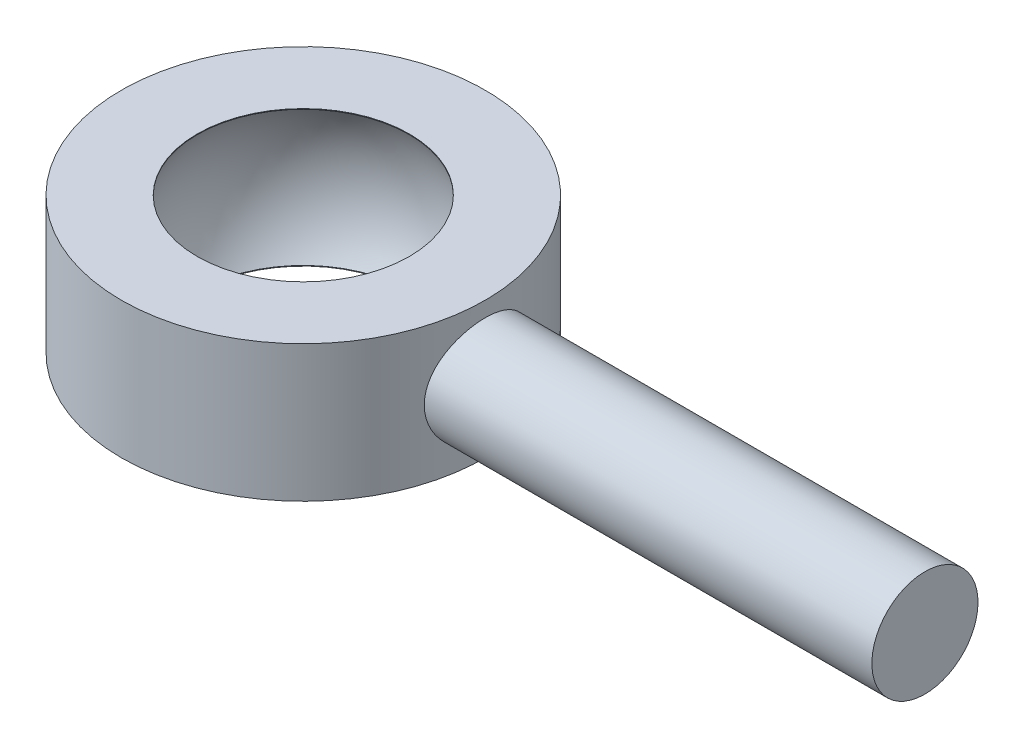
ISO-10303-21;
HEADER;
FILE_DESCRIPTION(('STEP AP214'),'2;1');
FILE_NAME('part.step','',(''),(''),'','','');
FILE_SCHEMA(('AUTOMOTIVE_DESIGN { 1 0 10303 214 1 1 1 1 }'));
ENDSEC;
DATA;
#1=APPLICATION_CONTEXT('core data for automotive mechanical design processes');
#2=APPLICATION_PROTOCOL_DEFINITION('international standard','automotive_design',2000,#1);
#3=PRODUCT_CONTEXT('',#1,'mechanical');
#4=PRODUCT('Part','Part','',(#3));
#5=PRODUCT_RELATED_PRODUCT_CATEGORY('part','',(#4));
#6=PRODUCT_DEFINITION_FORMATION('','',#4);
#7=PRODUCT_DEFINITION_CONTEXT('part definition',#1,'design');
#8=PRODUCT_DEFINITION('design','',#6,#7);
#9=PRODUCT_DEFINITION_SHAPE('','',#8);
#10=(LENGTH_UNIT() NAMED_UNIT(*) SI_UNIT(.MILLI.,.METRE.));
#11=(NAMED_UNIT(*) PLANE_ANGLE_UNIT() SI_UNIT($,.RADIAN.));
#12=(NAMED_UNIT(*) SI_UNIT($,.STERADIAN.) SOLID_ANGLE_UNIT());
#13=UNCERTAINTY_MEASURE_WITH_UNIT(LENGTH_MEASURE(1.E-05),#10,'distance_accuracy_value','');
#14=(GEOMETRIC_REPRESENTATION_CONTEXT(3) GLOBAL_UNCERTAINTY_ASSIGNED_CONTEXT((#13)) GLOBAL_UNIT_ASSIGNED_CONTEXT((#10,
#11,#12)) REPRESENTATION_CONTEXT('',''));
#15=CARTESIAN_POINT('',(0.,0.,0.));
#16=DIRECTION('',(0.,0.,1.));
#17=DIRECTION('',(1.,0.,0.));
#18=AXIS2_PLACEMENT_3D('',#15,#16,#17);
#19=CARTESIAN_POINT('',(-12.,4.5,0.));
#20=DIRECTION('',(0.,-1.,0.));
#21=DIRECTION('',(0.,0.,-1.));
#22=AXIS2_PLACEMENT_3D('',#19,#20,#21);
#23=CYLINDRICAL_SURFACE('',#22,7.);
#24=CARTESIAN_POINT('',(-12.,-4.45982062419555,0.));
#25=DIRECTION('',(0.,1.,0.));
#26=DIRECTION('',(0.,0.,1.));
#27=AXIS2_PLACEMENT_3D('',#24,#25,#26);
#28=CIRCLE('',#27,7.);
#29=CARTESIAN_POINT('',(-12.,-4.45982062419555,7.));
#30=VERTEX_POINT('',#29);
#31=EDGE_CURVE('E46',#30,#30,#28,.F.);
#32=ORIENTED_EDGE('',*,*,#31,.F.);
#33=EDGE_LOOP('',(#32));
#34=FACE_BOUND('',#33,.T.);
#35=CARTESIAN_POINT('',(-12.,-4.5,0.));
#36=DIRECTION('',(0.,1.,0.));
#37=DIRECTION('',(0.,0.,1.));
#38=AXIS2_PLACEMENT_3D('',#35,#36,#37);
#39=CIRCLE('',#38,7.);
#40=CARTESIAN_POINT('',(-12.,-4.5,7.));
#41=VERTEX_POINT('',#40);
#42=EDGE_CURVE('E108',#41,#41,#39,.T.);
#43=ORIENTED_EDGE('',*,*,#42,.F.);
#44=EDGE_LOOP('',(#43));
#45=FACE_BOUND('',#44,.T.);
#46=ADVANCED_FACE('F41',(#34,#45),#23,.F.);
#47=CARTESIAN_POINT('',(-12.,4.5,0.));
#48=DIRECTION('',(0.,1.,0.));
#49=DIRECTION('',(0.,0.,1.));
#50=AXIS2_PLACEMENT_3D('',#47,#48,#49);
#51=PLANE('',#50);
#52=CARTESIAN_POINT('',(-12.,4.5,0.));
#53=DIRECTION('',(0.,1.,0.));
#54=DIRECTION('',(0.,0.,1.));
#55=AXIS2_PLACEMENT_3D('',#52,#53,#54);
#56=CIRCLE('',#55,12.);
#57=CARTESIAN_POINT('',(-12.,4.5,12.));
#58=VERTEX_POINT('',#57);
#59=EDGE_CURVE('E55',#58,#58,#56,.T.);
#60=ORIENTED_EDGE('',*,*,#59,.T.);
#61=EDGE_LOOP('',(#60));
#62=FACE_BOUND('',#61,.T.);
#63=CARTESIAN_POINT('',(-12.,4.5,0.));
#64=DIRECTION('',(0.,1.,0.));
#65=DIRECTION('',(0.,0.,1.));
#66=AXIS2_PLACEMENT_3D('',#63,#64,#65);
#67=CIRCLE('',#66,7.);
#68=CARTESIAN_POINT('',(-12.,4.5,7.));
#69=VERTEX_POINT('',#68);
#70=EDGE_CURVE('E103',#69,#69,#67,.T.);
#71=ORIENTED_EDGE('',*,*,#70,.F.);
#72=EDGE_LOOP('',(#71));
#73=FACE_BOUND('',#72,.T.);
#74=ADVANCED_FACE('F69',(#62,#73),#51,.T.);
#75=CARTESIAN_POINT('',(-12.,4.5,0.));
#76=DIRECTION('',(0.,-1.,0.));
#77=DIRECTION('',(0.,0.,-1.));
#78=AXIS2_PLACEMENT_3D('',#75,#76,#77);
#79=CYLINDRICAL_SURFACE('',#78,12.);
#80=CARTESIAN_POINT('',(-0.521759716751001,0.,-3.5));
#81=CARTESIAN_POINT('',(-0.521757295311629,0.192054319913251,-3.49999696286623));
#82=CARTESIAN_POINT('',(-0.51688678631151,0.38413898889608,-3.48413840403905));
#83=CARTESIAN_POINT('',(-0.498003614826217,0.762710310940683,-3.42127517544508));
#84=CARTESIAN_POINT('',(-0.483987509541419,0.949194828197747,-3.37425877640989));
#85=CARTESIAN_POINT('',(-0.448532671250005,1.31103196548036,-3.25079782037676));
#86=CARTESIAN_POINT('',(-0.42710578599941,1.48640182836943,-3.17440021398415));
#87=CARTESIAN_POINT('',(-0.379259441413058,1.8218747579113,-2.99449806960499));
#88=CARTESIAN_POINT('',(-0.352839325000468,1.98197581111103,-2.89098996336001));
#89=CARTESIAN_POINT('',(-0.297097239994067,2.28715528113393,-2.65649108658758));
#90=CARTESIAN_POINT('',(-0.267716059999761,2.43170941722325,-2.52483193403778));
#91=CARTESIAN_POINT('',(-0.20986950760281,2.69703124061767,-2.23920199384476));
#92=CARTESIAN_POINT('',(-0.181404247017523,2.81779603281872,-2.08522849455367));
#93=CARTESIAN_POINT('',(-0.127927275855424,3.03436409529048,-1.75563543194071));
#94=CARTESIAN_POINT('',(-0.102993491279187,3.12963626955094,-1.57965314938518));
#95=CARTESIAN_POINT('',(-0.0600745361078176,3.28903382975871,-1.21331555166962));
#96=CARTESIAN_POINT('',(-0.0420879531270309,3.35316554733109,-1.02296316740898));
#97=CARTESIAN_POINT('',(-0.0155088824085107,3.44673668029716,-0.638770652831314));
#98=CARTESIAN_POINT('',(-0.00667473818463911,3.47707021864098,-0.445165306381285));
#99=CARTESIAN_POINT('',(0.00145352374923532,3.50500747804645,-0.0554253886246924));
#100=CARTESIAN_POINT('',(0.000749539076122961,3.50261770943008,0.14070867183541));
#101=CARTESIAN_POINT('',(-0.00994668649007664,3.46578404975842,0.523678678020408));
#102=CARTESIAN_POINT('',(-0.0196585234871959,3.43230780709568,0.71061674652038));
#103=CARTESIAN_POINT('',(-0.0469410355968007,3.33582758307802,1.07609625263408));
#104=CARTESIAN_POINT('',(-0.0645121973369639,3.27282177332232,1.25463716956276));
#105=CARTESIAN_POINT('',(-0.105934000809501,3.11839365061319,1.6005983824538));
#106=CARTESIAN_POINT('',(-0.129852976852992,3.02666002072006,1.76787119601618));
#107=CARTESIAN_POINT('',(-0.181422680907727,2.81762444777958,2.08496400151024));
#108=CARTESIAN_POINT('',(-0.209074254364043,2.70031670840276,2.23478002505818));
#109=CARTESIAN_POINT('',(-0.266331786572174,2.43841266854742,2.51848283881575));
#110=CARTESIAN_POINT('',(-0.295972240425294,2.29297628495534,2.65158814049179));
#111=CARTESIAN_POINT('',(-0.352976637943892,1.98155158066776,2.89173320382774));
#112=CARTESIAN_POINT('',(-0.38034038024257,1.81556144529201,2.99877066149234));
#113=CARTESIAN_POINT('',(-0.429851613256215,1.46577922805441,3.1844975706006));
#114=CARTESIAN_POINT('',(-0.451952072450695,1.2818459374275,3.26293452741342));
#115=CARTESIAN_POINT('',(-0.48787099501051,0.90258996382488,3.38749702322845));
#116=CARTESIAN_POINT('',(-0.50169198697179,0.707270778182911,3.43363242803382));
#117=CARTESIAN_POINT('',(-0.518936281294805,0.318192165633026,3.49085134441019));
#118=CARTESIAN_POINT('',(-0.522710101013617,0.12462197576152,3.50311706489073));
#119=CARTESIAN_POINT('',(-0.520399403487547,-0.261812448404875,3.49553843290767));
#120=CARTESIAN_POINT('',(-0.514316176930623,-0.45467677181226,3.47569828440757));
#121=CARTESIAN_POINT('',(-0.493319467601853,-0.829393663833188,3.40552137026396));
#122=CARTESIAN_POINT('',(-0.478622752392329,-1.01139967774621,3.35593256227463));
#123=CARTESIAN_POINT('',(-0.442276286336255,-1.3645003934711,3.22852632632489));
#124=CARTESIAN_POINT('',(-0.420625502838271,-1.53559347022977,3.15070470568188));
#125=CARTESIAN_POINT('',(-0.372120430164632,-1.86685570801902,2.96675904259821));
#126=CARTESIAN_POINT('',(-0.345147058820198,-2.02663279365816,2.8599610942228));
#127=CARTESIAN_POINT('',(-0.289297968185874,-2.32643040505443,2.62190362455645));
#128=CARTESIAN_POINT('',(-0.260421819819611,-2.46644645217717,2.49063857364422));
#129=CARTESIAN_POINT('',(-0.202783865184941,-2.72784930285609,2.20183802552396));
#130=CARTESIAN_POINT('',(-0.174062275035525,-2.84840140702085,2.04353719240707));
#131=CARTESIAN_POINT('',(-0.121003757978662,-3.06124277601848,1.70827645314679));
#132=CARTESIAN_POINT('',(-0.0966666057348402,-3.15353349350435,1.53131750667088));
#133=CARTESIAN_POINT('',(-0.0552718890727842,-3.30634556970008,1.16496975824715));
#134=CARTESIAN_POINT('',(-0.0381595779408091,-3.36710668199115,0.975687458510748));
#135=CARTESIAN_POINT('',(-0.0129007782539957,-3.45577467725069,0.589013781580671));
#136=CARTESIAN_POINT('',(-0.00475187751736208,-3.48369039952385,0.391624600904921));
#137=CARTESIAN_POINT('',(0.00152356547553752,-3.50523315149888,0.00207487923933639));
#138=CARTESIAN_POINT('',(4.91736449784747E-06,-3.50007401434837,-0.190013681462302));
#139=CARTESIAN_POINT('',(-0.0120566434230335,-3.45849353885937,-0.570471432028531));
#140=CARTESIAN_POINT('',(-0.0225990918399476,-3.42207380882634,-0.758840812728705));
#141=CARTESIAN_POINT('',(-0.0514301448433681,-3.31974179524093,-1.1247529597905));
#142=CARTESIAN_POINT('',(-0.0696429277148577,-3.25411784653956,-1.30238274255004));
#143=CARTESIAN_POINT('',(-0.111927020049091,-3.09549711351658,-1.64420678839108));
#144=CARTESIAN_POINT('',(-0.13599926057279,-3.00249597849994,-1.80839891069819));
#145=CARTESIAN_POINT('',(-0.188380133951649,-2.78844690367086,-2.12415926367373));
#146=CARTESIAN_POINT('',(-0.21679609656977,-2.66662590053017,-2.2751855176197));
#147=CARTESIAN_POINT('',(-0.274296338931485,-2.39980626216935,-2.55505931549894));
#148=CARTESIAN_POINT('',(-0.30338080451788,-2.25480111340017,-2.68390060541108));
#149=CARTESIAN_POINT('',(-0.359868639461855,-1.94090408824677,-2.91932045343864));
#150=CARTESIAN_POINT('',(-0.387203104011385,-1.77146170351348,-3.02518327680785));
#151=CARTESIAN_POINT('',(-0.436029720853715,-1.41641169320717,-3.2067877796471));
#152=CARTESIAN_POINT('',(-0.457524953845135,-1.23081266017902,-3.28254535203894));
#153=CARTESIAN_POINT('',(-0.489885226376148,-0.872145699717058,-3.39414253014114));
#154=CARTESIAN_POINT('',(-0.501729619399475,-0.700326124095811,-3.43373412539387));
#155=CARTESIAN_POINT('',(-0.517667299215167,-0.35234570416982,-3.48666196340722));
#156=CARTESIAN_POINT('',(-0.521761938116307,-0.176185622592397,-3.50000278618729));
#157=CARTESIAN_POINT('',(-0.521759716751001,0.,-3.5));
#158=B_SPLINE_CURVE_WITH_KNOTS('',3,(#80,#81,#82,#83,#84,#85,#86,#87,#88,#89,#90,#91,#92,#93,
#94,#95,#96,#97,#98,#99,#100,#101,#102,#103,#104,#105,#106,#107,#108,#109,#110,#111,#112,#113,
#114,#115,#116,#117,#118,#119,#120,#121,#122,#123,#124,#125,#126,#127,#128,#129,#130,#131,#132,
#133,#134,#135,#136,#137,#138,#139,#140,#141,#142,#143,#144,#145,#146,#147,#148,#149,#150,#151,
#152,#153,#154,#155,#156,#157),.UNSPECIFIED.,.T.,.F.,(4,2,2,2,2,2,2,2,2,2,2,2,2,2,2,2,2,2,2,2,2,
2,2,2,2,2,2,2,2,2,2,2,2,2,2,2,2,2,4),(0.,0.575513594445045,1.15124396228672,1.72605812132359,
2.30094797491025,2.89140733576458,3.48193850972388,4.08395369887512,4.6858464321396,
5.27140742237366,5.85685191658268,6.42466263730569,6.99250852016783,7.56673437126963,
8.14109050526404,8.73642088008382,9.33180385384536,9.93232260704006,10.5326578647986,
11.1117566103212,11.6907795344103,12.2558210221695,12.8209464551607,13.4005475845364,
13.980279864273,14.5805298255139,15.1807489283497,15.7763344482942,16.3717596484225,
16.9454613073561,17.5191334520636,18.0872631970786,18.6554832762436,19.2411395479404,
19.8269606489061,20.4290129483143,21.030746993546,21.5588002891225,22.0867614461196),.UNSPECIFIED.);
#159=CARTESIAN_POINT('',(-0.521759716751001,0.,-3.5));
#160=VERTEX_POINT('',#159);
#161=EDGE_CURVE('E50',#160,#160,#158,.T.);
#162=ORIENTED_EDGE('',*,*,#161,.F.);
#163=EDGE_LOOP('',(#162));
#164=FACE_BOUND('',#163,.T.);
#165=ORIENTED_EDGE('',*,*,#59,.F.);
#166=EDGE_LOOP('',(#165));
#167=FACE_BOUND('',#166,.T.);
#168=CARTESIAN_POINT('',(-12.,-4.5,0.));
#169=DIRECTION('',(0.,1.,0.));
#170=DIRECTION('',(0.,0.,1.));
#171=AXIS2_PLACEMENT_3D('',#168,#169,#170);
#172=CIRCLE('',#171,12.);
#173=CARTESIAN_POINT('',(-12.,-4.5,12.));
#174=VERTEX_POINT('',#173);
#175=EDGE_CURVE('E105',#174,#174,#172,.T.);
#176=ORIENTED_EDGE('',*,*,#175,.T.);
#177=EDGE_LOOP('',(#176));
#178=FACE_BOUND('',#177,.T.);
#179=ADVANCED_FACE('F64',(#164,#167,#178),#79,.T.);
#180=CARTESIAN_POINT('',(-12.,4.45982062419555,0.));
#181=DIRECTION('',(0.,-1.,0.));
#182=DIRECTION('',(0.,0.,-1.));
#183=AXIS2_PLACEMENT_3D('',#180,#181,#182);
#184=CIRCLE('',#183,7.);
#185=CARTESIAN_POINT('',(-12.,4.45982062419555,-7.));
#186=VERTEX_POINT('',#185);
#187=EDGE_CURVE('E63',#186,#186,#184,.F.);
#188=ORIENTED_EDGE('',*,*,#187,.F.);
#189=EDGE_LOOP('',(#188));
#190=FACE_BOUND('',#189,.T.);
#191=ORIENTED_EDGE('',*,*,#70,.T.);
#192=EDGE_LOOP('',(#191));
#193=FACE_BOUND('',#192,.T.);
#194=ADVANCED_FACE('F68',(#190,#193),#23,.F.);
#195=CARTESIAN_POINT('',(-12.,-4.5,0.));
#196=DIRECTION('',(0.,1.,0.));
#197=DIRECTION('',(0.,0.,1.));
#198=AXIS2_PLACEMENT_3D('',#195,#196,#197);
#199=PLANE('',#198);
#200=ORIENTED_EDGE('',*,*,#42,.T.);
#201=EDGE_LOOP('',(#200));
#202=FACE_BOUND('',#201,.T.);
#203=ORIENTED_EDGE('',*,*,#175,.F.);
#204=EDGE_LOOP('',(#203));
#205=FACE_BOUND('',#204,.T.);
#206=ADVANCED_FACE('F82',(#202,#205),#199,.F.);
#207=CARTESIAN_POINT('',(-2.,0.,0.));
#208=DIRECTION('',(1.,0.,0.));
#209=DIRECTION('',(0.,0.,-1.));
#210=AXIS2_PLACEMENT_3D('',#207,#208,#209);
#211=CYLINDRICAL_SURFACE('',#210,3.5);
#212=CARTESIAN_POINT('',(29.,0.,0.));
#213=DIRECTION('',(1.,0.,0.));
#214=DIRECTION('',(0.,0.,-1.));
#215=AXIS2_PLACEMENT_3D('',#212,#213,#214);
#216=CIRCLE('',#215,3.5);
#217=CARTESIAN_POINT('',(29.,0.,-3.5));
#218=VERTEX_POINT('',#217);
#219=EDGE_CURVE('E10',#218,#218,#216,.T.);
#220=ORIENTED_EDGE('',*,*,#219,.F.);
#221=EDGE_LOOP('',(#220));
#222=FACE_BOUND('',#221,.T.);
#223=ORIENTED_EDGE('',*,*,#161,.T.);
#224=EDGE_LOOP('',(#223));
#225=FACE_BOUND('',#224,.T.);
#226=ADVANCED_FACE('F43',(#222,#225),#211,.T.);
#227=CARTESIAN_POINT('',(29.,0.,0.));
#228=DIRECTION('',(1.,0.,0.));
#229=DIRECTION('',(0.,0.,-1.));
#230=AXIS2_PLACEMENT_3D('',#227,#228,#229);
#231=PLANE('',#230);
#232=ORIENTED_EDGE('',*,*,#219,.T.);
#233=EDGE_LOOP('',(#232));
#234=FACE_BOUND('',#233,.T.);
#235=ADVANCED_FACE('F72',(#234),#231,.T.);
#236=CARTESIAN_POINT('',(-12.,0.,0.));
#237=DIRECTION('',(0.,0.,-1.));
#238=DIRECTION('',(1.,0.,0.));
#239=AXIS2_PLACEMENT_3D('',#236,#237,#238);
#240=SPHERICAL_SURFACE('',#239,8.3);
#241=CARTESIAN_POINT('',(-12.,0.,0.));
#242=DIRECTION('',(0.,1.,0.));
#243=DIRECTION('',(0.,0.,1.));
#244=AXIS2_PLACEMENT_3D('',#241,#242,#243);
#245=SPHERICAL_SURFACE('',#244,8.3);
#246=ORIENTED_EDGE('',*,*,#31,.T.);
#247=EDGE_LOOP('',(#246));
#248=FACE_BOUND('',#247,.T.);
#249=ORIENTED_EDGE('',*,*,#187,.T.);
#250=EDGE_LOOP('',(#249));
#251=FACE_BOUND('',#250,.T.);
#252=ADVANCED_FACE('F74',(#248,#251),#245,.F.);
#253=CLOSED_SHELL('',(#46,#74,#179,#194,#206,#226,#235,#252));
#254=MANIFOLD_SOLID_BREP('B2',#253);
#255=ADVANCED_BREP_SHAPE_REPRESENTATION('',(#18,#254),#14);
#256=SHAPE_DEFINITION_REPRESENTATION(#9,#255);
ENDSEC;
END-ISO-10303-21;
